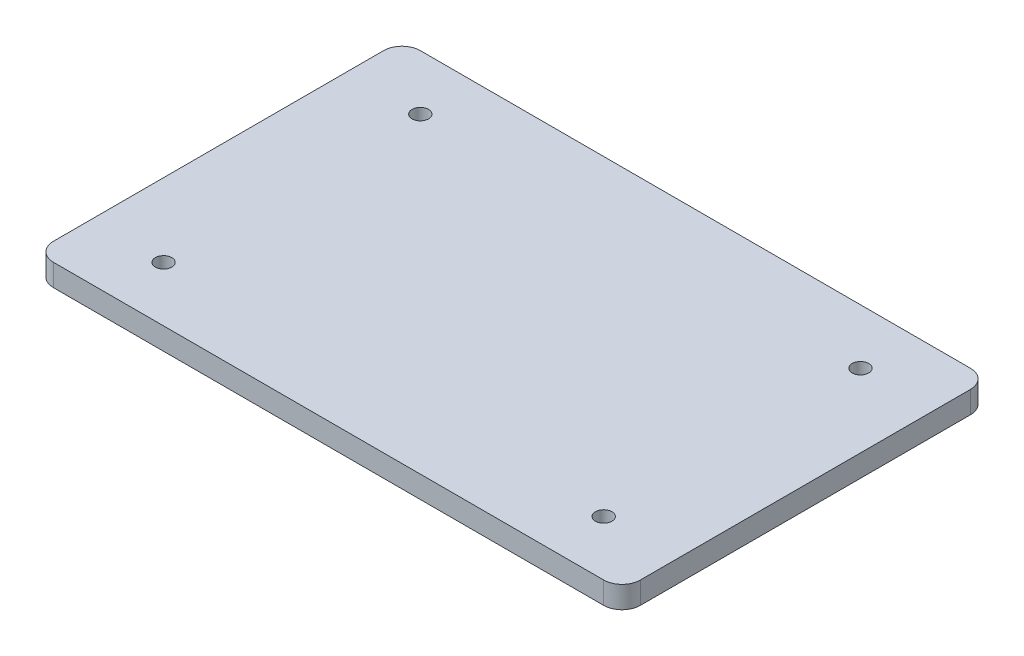
ISO-10303-21;
HEADER;
FILE_DESCRIPTION(('STEP AP214'),'2;1');
FILE_NAME('part.step','',(''),(''),'','','');
FILE_SCHEMA(('AUTOMOTIVE_DESIGN { 1 0 10303 214 1 1 1 1 }'));
ENDSEC;
DATA;
#1=APPLICATION_CONTEXT('core data for automotive mechanical design processes');
#2=APPLICATION_PROTOCOL_DEFINITION('international standard','automotive_design',2000,#1);
#3=PRODUCT_CONTEXT('',#1,'mechanical');
#4=PRODUCT('Part','Part','',(#3));
#5=PRODUCT_RELATED_PRODUCT_CATEGORY('part','',(#4));
#6=PRODUCT_DEFINITION_FORMATION('','',#4);
#7=PRODUCT_DEFINITION_CONTEXT('part definition',#1,'design');
#8=PRODUCT_DEFINITION('design','',#6,#7);
#9=PRODUCT_DEFINITION_SHAPE('','',#8);
#10=(LENGTH_UNIT() NAMED_UNIT(*) SI_UNIT(.MILLI.,.METRE.));
#11=(NAMED_UNIT(*) PLANE_ANGLE_UNIT() SI_UNIT($,.RADIAN.));
#12=(NAMED_UNIT(*) SI_UNIT($,.STERADIAN.) SOLID_ANGLE_UNIT());
#13=UNCERTAINTY_MEASURE_WITH_UNIT(LENGTH_MEASURE(1.E-05),#10,'distance_accuracy_value','');
#14=(GEOMETRIC_REPRESENTATION_CONTEXT(3) GLOBAL_UNCERTAINTY_ASSIGNED_CONTEXT((#13)) GLOBAL_UNIT_ASSIGNED_CONTEXT((#10,
#11,#12)) REPRESENTATION_CONTEXT('',''));
#15=CARTESIAN_POINT('',(0.,0.,0.));
#16=DIRECTION('',(0.,0.,1.));
#17=DIRECTION('',(1.,0.,0.));
#18=AXIS2_PLACEMENT_3D('',#15,#16,#17);
#19=CARTESIAN_POINT('',(0.,0.,0.));
#20=DIRECTION('',(0.,-1.,0.));
#21=DIRECTION('',(0.,0.,-1.));
#22=AXIS2_PLACEMENT_3D('',#19,#20,#21);
#23=PLANE('',#22);
#24=CARTESIAN_POINT('',(-60.,0.,-35.));
#25=DIRECTION('',(0.,1.,0.));
#26=DIRECTION('',(0.,0.,1.));
#27=AXIS2_PLACEMENT_3D('',#24,#25,#26);
#28=CIRCLE('',#27,2.25);
#29=CARTESIAN_POINT('',(-60.,0.,-32.75));
#30=VERTEX_POINT('',#29);
#31=EDGE_CURVE('E188',#30,#30,#28,.T.);
#32=ORIENTED_EDGE('',*,*,#31,.T.);
#33=EDGE_LOOP('',(#32));
#34=FACE_BOUND('',#33,.T.);
#35=DIRECTION('',(-1.,0.,0.));
#36=VECTOR('',#35,1.);
#37=CARTESIAN_POINT('',(80.,0.,-50.));
#38=LINE('',#37,#36);
#39=CARTESIAN_POINT('',(75.,0.,-50.));
#40=VERTEX_POINT('',#39);
#41=CARTESIAN_POINT('',(-75.,0.,-50.));
#42=VERTEX_POINT('',#41);
#43=EDGE_CURVE('E123',#40,#42,#38,.T.);
#44=ORIENTED_EDGE('',*,*,#43,.F.);
#45=CARTESIAN_POINT('',(75.,0.,-45.));
#46=DIRECTION('',(0.,-1.,0.));
#47=DIRECTION('',(0.,0.,-1.));
#48=AXIS2_PLACEMENT_3D('',#45,#46,#47);
#49=CIRCLE('',#48,5.);
#50=CARTESIAN_POINT('',(80.,0.,-45.));
#51=VERTEX_POINT('',#50);
#52=EDGE_CURVE('E102',#40,#51,#49,.T.);
#53=ORIENTED_EDGE('',*,*,#52,.T.);
#54=DIRECTION('',(0.,0.,-1.));
#55=VECTOR('',#54,1.);
#56=CARTESIAN_POINT('',(80.,0.,-50.));
#57=LINE('',#56,#55);
#58=CARTESIAN_POINT('',(80.,0.,45.));
#59=VERTEX_POINT('',#58);
#60=EDGE_CURVE('E132',#59,#51,#57,.T.);
#61=ORIENTED_EDGE('',*,*,#60,.F.);
#62=CARTESIAN_POINT('',(75.,0.,45.));
#63=DIRECTION('',(0.,-1.,0.));
#64=DIRECTION('',(0.,0.,-1.));
#65=AXIS2_PLACEMENT_3D('',#62,#63,#64);
#66=CIRCLE('',#65,5.);
#67=CARTESIAN_POINT('',(75.,0.,50.));
#68=VERTEX_POINT('',#67);
#69=EDGE_CURVE('E143',#59,#68,#66,.T.);
#70=ORIENTED_EDGE('',*,*,#69,.T.);
#71=DIRECTION('',(1.,0.,0.));
#72=VECTOR('',#71,1.);
#73=CARTESIAN_POINT('',(80.,0.,50.));
#74=LINE('',#73,#72);
#75=CARTESIAN_POINT('',(-75.,0.,50.));
#76=VERTEX_POINT('',#75);
#77=EDGE_CURVE('E133',#76,#68,#74,.T.);
#78=ORIENTED_EDGE('',*,*,#77,.F.);
#79=CARTESIAN_POINT('',(-75.,0.,45.));
#80=DIRECTION('',(0.,-1.,0.));
#81=DIRECTION('',(0.,0.,-1.));
#82=AXIS2_PLACEMENT_3D('',#79,#80,#81);
#83=CIRCLE('',#82,5.);
#84=CARTESIAN_POINT('',(-80.,0.,45.));
#85=VERTEX_POINT('',#84);
#86=EDGE_CURVE('E121',#76,#85,#83,.T.);
#87=ORIENTED_EDGE('',*,*,#86,.T.);
#88=DIRECTION('',(0.,0.,1.));
#89=VECTOR('',#88,1.);
#90=CARTESIAN_POINT('',(-80.,0.,-50.));
#91=LINE('',#90,#89);
#92=CARTESIAN_POINT('',(-80.,0.,-45.));
#93=VERTEX_POINT('',#92);
#94=EDGE_CURVE('E163',#93,#85,#91,.T.);
#95=ORIENTED_EDGE('',*,*,#94,.F.);
#96=CARTESIAN_POINT('',(-75.,0.,-45.));
#97=DIRECTION('',(0.,-1.,0.));
#98=DIRECTION('',(0.,0.,-1.));
#99=AXIS2_PLACEMENT_3D('',#96,#97,#98);
#100=CIRCLE('',#99,5.);
#101=EDGE_CURVE('E113',#93,#42,#100,.T.);
#102=ORIENTED_EDGE('',*,*,#101,.T.);
#103=EDGE_LOOP('',(#44,#53,#61,#70,#78,#87,#95,#102));
#104=FACE_BOUND('',#103,.T.);
#105=CARTESIAN_POINT('',(-60.,0.,35.));
#106=DIRECTION('',(0.,1.,0.));
#107=DIRECTION('',(0.,0.,1.));
#108=AXIS2_PLACEMENT_3D('',#105,#106,#107);
#109=CIRCLE('',#108,2.25);
#110=CARTESIAN_POINT('',(-60.,0.,37.25));
#111=VERTEX_POINT('',#110);
#112=EDGE_CURVE('E164',#111,#111,#109,.T.);
#113=ORIENTED_EDGE('',*,*,#112,.T.);
#114=EDGE_LOOP('',(#113));
#115=FACE_BOUND('',#114,.T.);
#116=CARTESIAN_POINT('',(60.,0.,35.));
#117=DIRECTION('',(0.,1.,0.));
#118=DIRECTION('',(0.,0.,1.));
#119=AXIS2_PLACEMENT_3D('',#116,#117,#118);
#120=CIRCLE('',#119,2.25);
#121=CARTESIAN_POINT('',(60.,0.,37.25));
#122=VERTEX_POINT('',#121);
#123=EDGE_CURVE('E177',#122,#122,#120,.T.);
#124=ORIENTED_EDGE('',*,*,#123,.T.);
#125=EDGE_LOOP('',(#124));
#126=FACE_BOUND('',#125,.T.);
#127=CARTESIAN_POINT('',(60.,0.,-35.));
#128=DIRECTION('',(0.,1.,0.));
#129=DIRECTION('',(0.,0.,1.));
#130=AXIS2_PLACEMENT_3D('',#127,#128,#129);
#131=CIRCLE('',#130,2.25);
#132=CARTESIAN_POINT('',(60.,0.,-32.75));
#133=VERTEX_POINT('',#132);
#134=EDGE_CURVE('E184',#133,#133,#131,.T.);
#135=ORIENTED_EDGE('',*,*,#134,.T.);
#136=EDGE_LOOP('',(#135));
#137=FACE_BOUND('',#136,.T.);
#138=ADVANCED_FACE('F39',(#34,#104,#115,#126,#137),#23,.T.);
#139=CARTESIAN_POINT('',(-80.,6.,-50.));
#140=DIRECTION('',(1.,0.,0.));
#141=DIRECTION('',(0.,0.,-1.));
#142=AXIS2_PLACEMENT_3D('',#139,#140,#141);
#143=PLANE('',#142);
#144=DIRECTION('',(0.,0.,1.));
#145=VECTOR('',#144,1.);
#146=CARTESIAN_POINT('',(-80.,6.,-50.));
#147=LINE('',#146,#145);
#148=CARTESIAN_POINT('',(-80.,6.,-45.));
#149=VERTEX_POINT('',#148);
#150=CARTESIAN_POINT('',(-80.,6.,45.));
#151=VERTEX_POINT('',#150);
#152=EDGE_CURVE('E128',#149,#151,#147,.T.);
#153=ORIENTED_EDGE('',*,*,#152,.F.);
#154=DIRECTION('',(0.,-1.,0.));
#155=VECTOR('',#154,1.);
#156=CARTESIAN_POINT('',(-80.,6.,-45.));
#157=LINE('',#156,#155);
#158=EDGE_CURVE('E156',#149,#93,#157,.T.);
#159=ORIENTED_EDGE('',*,*,#158,.T.);
#160=ORIENTED_EDGE('',*,*,#94,.T.);
#161=DIRECTION('',(0.,-1.,0.));
#162=VECTOR('',#161,1.);
#163=CARTESIAN_POINT('',(-80.,6.,45.));
#164=LINE('',#163,#162);
#165=EDGE_CURVE('E152',#85,#151,#164,.F.);
#166=ORIENTED_EDGE('',*,*,#165,.T.);
#167=EDGE_LOOP('',(#153,#159,#160,#166));
#168=FACE_BOUND('',#167,.T.);
#169=ADVANCED_FACE('F223',(#168),#143,.F.);
#170=CARTESIAN_POINT('',(80.,6.,50.));
#171=DIRECTION('',(0.,0.,-1.));
#172=DIRECTION('',(-1.,0.,0.));
#173=AXIS2_PLACEMENT_3D('',#170,#171,#172);
#174=PLANE('',#173);
#175=ORIENTED_EDGE('',*,*,#77,.T.);
#176=DIRECTION('',(0.,-1.,0.));
#177=VECTOR('',#176,1.);
#178=CARTESIAN_POINT('',(75.,6.,50.));
#179=LINE('',#178,#177);
#180=CARTESIAN_POINT('',(75.,6.,50.));
#181=VERTEX_POINT('',#180);
#182=EDGE_CURVE('E11',#68,#181,#179,.F.);
#183=ORIENTED_EDGE('',*,*,#182,.T.);
#184=DIRECTION('',(1.,0.,0.));
#185=VECTOR('',#184,1.);
#186=CARTESIAN_POINT('',(80.,6.,50.));
#187=LINE('',#186,#185);
#188=CARTESIAN_POINT('',(-75.,6.,50.));
#189=VERTEX_POINT('',#188);
#190=EDGE_CURVE('E134',#189,#181,#187,.T.);
#191=ORIENTED_EDGE('',*,*,#190,.F.);
#192=DIRECTION('',(0.,-1.,0.));
#193=VECTOR('',#192,1.);
#194=CARTESIAN_POINT('',(-75.,6.,50.));
#195=LINE('',#194,#193);
#196=EDGE_CURVE('E50',#189,#76,#195,.T.);
#197=ORIENTED_EDGE('',*,*,#196,.T.);
#198=EDGE_LOOP('',(#175,#183,#191,#197));
#199=FACE_BOUND('',#198,.T.);
#200=ADVANCED_FACE('F161',(#199),#174,.F.);
#201=CARTESIAN_POINT('',(80.,6.,-50.));
#202=DIRECTION('',(-1.,0.,0.));
#203=DIRECTION('',(0.,0.,1.));
#204=AXIS2_PLACEMENT_3D('',#201,#202,#203);
#205=PLANE('',#204);
#206=ORIENTED_EDGE('',*,*,#60,.T.);
#207=DIRECTION('',(0.,-1.,0.));
#208=VECTOR('',#207,1.);
#209=CARTESIAN_POINT('',(80.,6.,-45.));
#210=LINE('',#209,#208);
#211=CARTESIAN_POINT('',(80.,6.,-45.));
#212=VERTEX_POINT('',#211);
#213=EDGE_CURVE('E108',#51,#212,#210,.F.);
#214=ORIENTED_EDGE('',*,*,#213,.T.);
#215=DIRECTION('',(0.,0.,-1.));
#216=VECTOR('',#215,1.);
#217=CARTESIAN_POINT('',(80.,6.,-50.));
#218=LINE('',#217,#216);
#219=CARTESIAN_POINT('',(80.,6.,45.));
#220=VERTEX_POINT('',#219);
#221=EDGE_CURVE('E166',#220,#212,#218,.T.);
#222=ORIENTED_EDGE('',*,*,#221,.F.);
#223=DIRECTION('',(0.,-1.,0.));
#224=VECTOR('',#223,1.);
#225=CARTESIAN_POINT('',(80.,6.,45.));
#226=LINE('',#225,#224);
#227=EDGE_CURVE('E111',#220,#59,#226,.T.);
#228=ORIENTED_EDGE('',*,*,#227,.T.);
#229=EDGE_LOOP('',(#206,#214,#222,#228));
#230=FACE_BOUND('',#229,.T.);
#231=ADVANCED_FACE('F215',(#230),#205,.F.);
#232=CARTESIAN_POINT('',(80.,6.,-50.));
#233=DIRECTION('',(0.,0.,1.));
#234=DIRECTION('',(1.,0.,0.));
#235=AXIS2_PLACEMENT_3D('',#232,#233,#234);
#236=PLANE('',#235);
#237=DIRECTION('',(-1.,0.,0.));
#238=VECTOR('',#237,1.);
#239=CARTESIAN_POINT('',(80.,6.,-50.));
#240=LINE('',#239,#238);
#241=CARTESIAN_POINT('',(75.,6.,-50.));
#242=VERTEX_POINT('',#241);
#243=CARTESIAN_POINT('',(-75.,6.,-50.));
#244=VERTEX_POINT('',#243);
#245=EDGE_CURVE('E125',#242,#244,#240,.T.);
#246=ORIENTED_EDGE('',*,*,#245,.F.);
#247=DIRECTION('',(0.,-1.,0.));
#248=VECTOR('',#247,1.);
#249=CARTESIAN_POINT('',(75.,6.,-50.));
#250=LINE('',#249,#248);
#251=EDGE_CURVE('E107',#242,#40,#250,.T.);
#252=ORIENTED_EDGE('',*,*,#251,.T.);
#253=ORIENTED_EDGE('',*,*,#43,.T.);
#254=DIRECTION('',(0.,-1.,0.));
#255=VECTOR('',#254,1.);
#256=CARTESIAN_POINT('',(-75.,6.,-50.));
#257=LINE('',#256,#255);
#258=EDGE_CURVE('E127',#42,#244,#257,.F.);
#259=ORIENTED_EDGE('',*,*,#258,.T.);
#260=EDGE_LOOP('',(#246,#252,#253,#259));
#261=FACE_BOUND('',#260,.T.);
#262=ADVANCED_FACE('F118',(#261),#236,.F.);
#263=CARTESIAN_POINT('',(0.,6.,0.));
#264=DIRECTION('',(0.,-1.,0.));
#265=DIRECTION('',(0.,0.,-1.));
#266=AXIS2_PLACEMENT_3D('',#263,#264,#265);
#267=PLANE('',#266);
#268=CARTESIAN_POINT('',(-60.,6.,-35.));
#269=DIRECTION('',(0.,1.,0.));
#270=DIRECTION('',(0.,0.,1.));
#271=AXIS2_PLACEMENT_3D('',#268,#269,#270);
#272=CIRCLE('',#271,2.25);
#273=CARTESIAN_POINT('',(-60.,6.,-32.75));
#274=VERTEX_POINT('',#273);
#275=EDGE_CURVE('E192',#274,#274,#272,.T.);
#276=ORIENTED_EDGE('',*,*,#275,.F.);
#277=EDGE_LOOP('',(#276));
#278=FACE_BOUND('',#277,.T.);
#279=CARTESIAN_POINT('',(60.,6.,-35.));
#280=DIRECTION('',(0.,1.,0.));
#281=DIRECTION('',(0.,0.,1.));
#282=AXIS2_PLACEMENT_3D('',#279,#280,#281);
#283=CIRCLE('',#282,2.25);
#284=CARTESIAN_POINT('',(60.,6.,-32.75));
#285=VERTEX_POINT('',#284);
#286=EDGE_CURVE('E190',#285,#285,#283,.T.);
#287=ORIENTED_EDGE('',*,*,#286,.F.);
#288=EDGE_LOOP('',(#287));
#289=FACE_BOUND('',#288,.T.);
#290=CARTESIAN_POINT('',(60.,6.,35.));
#291=DIRECTION('',(0.,1.,0.));
#292=DIRECTION('',(0.,0.,1.));
#293=AXIS2_PLACEMENT_3D('',#290,#291,#292);
#294=CIRCLE('',#293,2.25);
#295=CARTESIAN_POINT('',(60.,6.,37.25));
#296=VERTEX_POINT('',#295);
#297=EDGE_CURVE('E182',#296,#296,#294,.T.);
#298=ORIENTED_EDGE('',*,*,#297,.F.);
#299=EDGE_LOOP('',(#298));
#300=FACE_BOUND('',#299,.T.);
#301=CARTESIAN_POINT('',(-60.,6.,35.));
#302=DIRECTION('',(0.,1.,0.));
#303=DIRECTION('',(0.,0.,1.));
#304=AXIS2_PLACEMENT_3D('',#301,#302,#303);
#305=CIRCLE('',#304,2.25);
#306=CARTESIAN_POINT('',(-60.,6.,37.25));
#307=VERTEX_POINT('',#306);
#308=EDGE_CURVE('E173',#307,#307,#305,.T.);
#309=ORIENTED_EDGE('',*,*,#308,.F.);
#310=EDGE_LOOP('',(#309));
#311=FACE_BOUND('',#310,.T.);
#312=ORIENTED_EDGE('',*,*,#221,.T.);
#313=CARTESIAN_POINT('',(75.,6.,-45.));
#314=DIRECTION('',(0.,-1.,0.));
#315=DIRECTION('',(0.,0.,-1.));
#316=AXIS2_PLACEMENT_3D('',#313,#314,#315);
#317=CIRCLE('',#316,5.);
#318=EDGE_CURVE('E155',#212,#242,#317,.F.);
#319=ORIENTED_EDGE('',*,*,#318,.T.);
#320=ORIENTED_EDGE('',*,*,#245,.T.);
#321=CARTESIAN_POINT('',(-75.,6.,-45.));
#322=DIRECTION('',(0.,-1.,0.));
#323=DIRECTION('',(0.,0.,-1.));
#324=AXIS2_PLACEMENT_3D('',#321,#322,#323);
#325=CIRCLE('',#324,5.);
#326=EDGE_CURVE('E147',#244,#149,#325,.F.);
#327=ORIENTED_EDGE('',*,*,#326,.T.);
#328=ORIENTED_EDGE('',*,*,#152,.T.);
#329=CARTESIAN_POINT('',(-75.,6.,45.));
#330=DIRECTION('',(0.,-1.,0.));
#331=DIRECTION('',(0.,0.,-1.));
#332=AXIS2_PLACEMENT_3D('',#329,#330,#331);
#333=CIRCLE('',#332,5.);
#334=EDGE_CURVE('E56',#151,#189,#333,.F.);
#335=ORIENTED_EDGE('',*,*,#334,.T.);
#336=ORIENTED_EDGE('',*,*,#190,.T.);
#337=CARTESIAN_POINT('',(75.,6.,45.));
#338=DIRECTION('',(0.,-1.,0.));
#339=DIRECTION('',(0.,0.,-1.));
#340=AXIS2_PLACEMENT_3D('',#337,#338,#339);
#341=CIRCLE('',#340,5.);
#342=EDGE_CURVE('E146',#181,#220,#341,.F.);
#343=ORIENTED_EDGE('',*,*,#342,.T.);
#344=EDGE_LOOP('',(#312,#319,#320,#327,#328,#335,#336,#343));
#345=FACE_BOUND('',#344,.T.);
#346=ADVANCED_FACE('F200',(#278,#289,#300,#311,#345),#267,.F.);
#347=CARTESIAN_POINT('',(75.,6.,-45.));
#348=DIRECTION('',(0.,-1.,0.));
#349=DIRECTION('',(0.,0.,-1.));
#350=AXIS2_PLACEMENT_3D('',#347,#348,#349);
#351=CYLINDRICAL_SURFACE('',#350,5.);
#352=ORIENTED_EDGE('',*,*,#318,.F.);
#353=ORIENTED_EDGE('',*,*,#213,.F.);
#354=ORIENTED_EDGE('',*,*,#52,.F.);
#355=ORIENTED_EDGE('',*,*,#251,.F.);
#356=EDGE_LOOP('',(#352,#353,#354,#355));
#357=FACE_BOUND('',#356,.T.);
#358=ADVANCED_FACE('F110',(#357),#351,.T.);
#359=CARTESIAN_POINT('',(-75.,6.,-45.));
#360=DIRECTION('',(0.,-1.,0.));
#361=DIRECTION('',(0.,0.,-1.));
#362=AXIS2_PLACEMENT_3D('',#359,#360,#361);
#363=CYLINDRICAL_SURFACE('',#362,5.);
#364=ORIENTED_EDGE('',*,*,#326,.F.);
#365=ORIENTED_EDGE('',*,*,#258,.F.);
#366=ORIENTED_EDGE('',*,*,#101,.F.);
#367=ORIENTED_EDGE('',*,*,#158,.F.);
#368=EDGE_LOOP('',(#364,#365,#366,#367));
#369=FACE_BOUND('',#368,.T.);
#370=ADVANCED_FACE('F216',(#369),#363,.T.);
#371=CARTESIAN_POINT('',(75.,6.,45.));
#372=DIRECTION('',(0.,-1.,0.));
#373=DIRECTION('',(0.,0.,-1.));
#374=AXIS2_PLACEMENT_3D('',#371,#372,#373);
#375=CYLINDRICAL_SURFACE('',#374,5.);
#376=ORIENTED_EDGE('',*,*,#342,.F.);
#377=ORIENTED_EDGE('',*,*,#182,.F.);
#378=ORIENTED_EDGE('',*,*,#69,.F.);
#379=ORIENTED_EDGE('',*,*,#227,.F.);
#380=EDGE_LOOP('',(#376,#377,#378,#379));
#381=FACE_BOUND('',#380,.T.);
#382=ADVANCED_FACE('F212',(#381),#375,.T.);
#383=CARTESIAN_POINT('',(-75.,6.,45.));
#384=DIRECTION('',(0.,-1.,0.));
#385=DIRECTION('',(0.,0.,-1.));
#386=AXIS2_PLACEMENT_3D('',#383,#384,#385);
#387=CYLINDRICAL_SURFACE('',#386,5.);
#388=ORIENTED_EDGE('',*,*,#334,.F.);
#389=ORIENTED_EDGE('',*,*,#165,.F.);
#390=ORIENTED_EDGE('',*,*,#86,.F.);
#391=ORIENTED_EDGE('',*,*,#196,.F.);
#392=EDGE_LOOP('',(#388,#389,#390,#391));
#393=FACE_BOUND('',#392,.T.);
#394=ADVANCED_FACE('F41',(#393),#387,.T.);
#395=CARTESIAN_POINT('',(-60.,6.,35.));
#396=DIRECTION('',(0.,1.,0.));
#397=DIRECTION('',(0.,0.,1.));
#398=AXIS2_PLACEMENT_3D('',#395,#396,#397);
#399=CYLINDRICAL_SURFACE('',#398,2.25);
#400=ORIENTED_EDGE('',*,*,#112,.F.);
#401=EDGE_LOOP('',(#400));
#402=FACE_BOUND('',#401,.T.);
#403=ORIENTED_EDGE('',*,*,#308,.T.);
#404=EDGE_LOOP('',(#403));
#405=FACE_BOUND('',#404,.T.);
#406=ADVANCED_FACE('F222',(#402,#405),#399,.F.);
#407=CARTESIAN_POINT('',(60.,6.,35.));
#408=DIRECTION('',(0.,1.,0.));
#409=DIRECTION('',(0.,0.,1.));
#410=AXIS2_PLACEMENT_3D('',#407,#408,#409);
#411=CYLINDRICAL_SURFACE('',#410,2.25);
#412=ORIENTED_EDGE('',*,*,#123,.F.);
#413=EDGE_LOOP('',(#412));
#414=FACE_BOUND('',#413,.T.);
#415=ORIENTED_EDGE('',*,*,#297,.T.);
#416=EDGE_LOOP('',(#415));
#417=FACE_BOUND('',#416,.T.);
#418=ADVANCED_FACE('F277',(#414,#417),#411,.F.);
#419=CARTESIAN_POINT('',(60.,6.,-35.));
#420=DIRECTION('',(0.,1.,0.));
#421=DIRECTION('',(0.,0.,1.));
#422=AXIS2_PLACEMENT_3D('',#419,#420,#421);
#423=CYLINDRICAL_SURFACE('',#422,2.25);
#424=ORIENTED_EDGE('',*,*,#134,.F.);
#425=EDGE_LOOP('',(#424));
#426=FACE_BOUND('',#425,.T.);
#427=ORIENTED_EDGE('',*,*,#286,.T.);
#428=EDGE_LOOP('',(#427));
#429=FACE_BOUND('',#428,.T.);
#430=ADVANCED_FACE('F283',(#426,#429),#423,.F.);
#431=CARTESIAN_POINT('',(-60.,6.,-35.));
#432=DIRECTION('',(0.,1.,0.));
#433=DIRECTION('',(0.,0.,1.));
#434=AXIS2_PLACEMENT_3D('',#431,#432,#433);
#435=CYLINDRICAL_SURFACE('',#434,2.25);
#436=ORIENTED_EDGE('',*,*,#31,.F.);
#437=EDGE_LOOP('',(#436));
#438=FACE_BOUND('',#437,.T.);
#439=ORIENTED_EDGE('',*,*,#275,.T.);
#440=EDGE_LOOP('',(#439));
#441=FACE_BOUND('',#440,.T.);
#442=ADVANCED_FACE('F197',(#438,#441),#435,.F.);
#443=CLOSED_SHELL('',(#138,#169,#200,#231,#262,#346,#358,#370,#382,#394,#406,#418,#430,#442));
#444=MANIFOLD_SOLID_BREP('B2',#443);
#445=ADVANCED_BREP_SHAPE_REPRESENTATION('',(#18,#444),#14);
#446=SHAPE_DEFINITION_REPRESENTATION(#9,#445);
ENDSEC;
END-ISO-10303-21;
